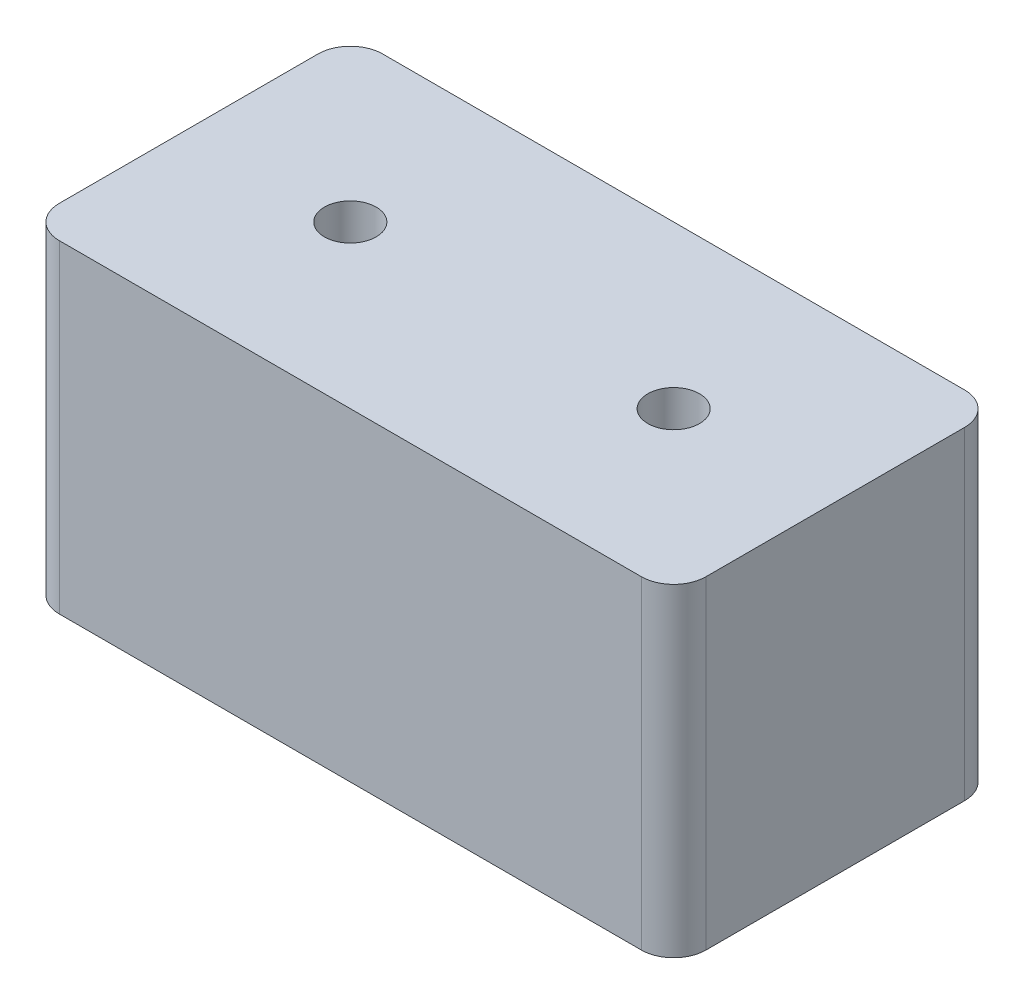
ISO-10303-21;
HEADER;
FILE_DESCRIPTION(('STEP AP214'),'2;1');
FILE_NAME('part.step','',(''),(''),'','','');
FILE_SCHEMA(('AUTOMOTIVE_DESIGN { 1 0 10303 214 1 1 1 1 }'));
ENDSEC;
DATA;
#1=APPLICATION_CONTEXT('core data for automotive mechanical design processes');
#2=APPLICATION_PROTOCOL_DEFINITION('international standard','automotive_design',2000,#1);
#3=PRODUCT_CONTEXT('',#1,'mechanical');
#4=PRODUCT('Part','Part','',(#3));
#5=PRODUCT_RELATED_PRODUCT_CATEGORY('part','',(#4));
#6=PRODUCT_DEFINITION_FORMATION('','',#4);
#7=PRODUCT_DEFINITION_CONTEXT('part definition',#1,'design');
#8=PRODUCT_DEFINITION('design','',#6,#7);
#9=PRODUCT_DEFINITION_SHAPE('','',#8);
#10=(LENGTH_UNIT() NAMED_UNIT(*) SI_UNIT(.MILLI.,.METRE.));
#11=(NAMED_UNIT(*) PLANE_ANGLE_UNIT() SI_UNIT($,.RADIAN.));
#12=(NAMED_UNIT(*) SI_UNIT($,.STERADIAN.) SOLID_ANGLE_UNIT());
#13=UNCERTAINTY_MEASURE_WITH_UNIT(LENGTH_MEASURE(1.E-05),#10,'distance_accuracy_value','');
#14=(GEOMETRIC_REPRESENTATION_CONTEXT(3) GLOBAL_UNCERTAINTY_ASSIGNED_CONTEXT((#13)) GLOBAL_UNIT_ASSIGNED_CONTEXT((#10,
#11,#12)) REPRESENTATION_CONTEXT('',''));
#15=CARTESIAN_POINT('',(0.,0.,0.));
#16=DIRECTION('',(0.,0.,1.));
#17=DIRECTION('',(1.,0.,0.));
#18=AXIS2_PLACEMENT_3D('',#15,#16,#17);
#19=CARTESIAN_POINT('',(0.,20.,0.));
#20=DIRECTION('',(0.,-1.,0.));
#21=DIRECTION('',(0.,0.,-1.));
#22=AXIS2_PLACEMENT_3D('',#19,#20,#21);
#23=PLANE('',#22);
#24=DIRECTION('',(0.,0.,-1.));
#25=VECTOR('',#24,1.);
#26=CARTESIAN_POINT('',(40.,20.,0.));
#27=LINE('',#26,#25);
#28=CARTESIAN_POINT('',(40.,20.,-2.));
#29=VERTEX_POINT('',#28);
#30=CARTESIAN_POINT('',(40.,20.,-18.));
#31=VERTEX_POINT('',#30);
#32=EDGE_CURVE('E204',#29,#31,#27,.T.);
#33=ORIENTED_EDGE('',*,*,#32,.T.);
#34=CARTESIAN_POINT('',(38.,20.,-18.));
#35=DIRECTION('',(0.,-1.,0.));
#36=DIRECTION('',(0.,0.,-1.));
#37=AXIS2_PLACEMENT_3D('',#34,#35,#36);
#38=CIRCLE('',#37,2.);
#39=CARTESIAN_POINT('',(38.,20.,-20.));
#40=VERTEX_POINT('',#39);
#41=EDGE_CURVE('E173',#31,#40,#38,.F.);
#42=ORIENTED_EDGE('',*,*,#41,.T.);
#43=DIRECTION('',(-1.,0.,0.));
#44=VECTOR('',#43,1.);
#45=CARTESIAN_POINT('',(0.,20.,-20.));
#46=LINE('',#45,#44);
#47=CARTESIAN_POINT('',(1.99999999999999,20.,-20.));
#48=VERTEX_POINT('',#47);
#49=EDGE_CURVE('E131',#40,#48,#46,.T.);
#50=ORIENTED_EDGE('',*,*,#49,.T.);
#51=CARTESIAN_POINT('',(1.99999999999999,20.,-18.));
#52=DIRECTION('',(0.,-1.,0.));
#53=DIRECTION('',(0.,0.,-1.));
#54=AXIS2_PLACEMENT_3D('',#51,#52,#53);
#55=CIRCLE('',#54,2.);
#56=CARTESIAN_POINT('',(0.,20.,-18.));
#57=VERTEX_POINT('',#56);
#58=EDGE_CURVE('E165',#48,#57,#55,.F.);
#59=ORIENTED_EDGE('',*,*,#58,.T.);
#60=DIRECTION('',(0.,0.,1.));
#61=VECTOR('',#60,1.);
#62=CARTESIAN_POINT('',(0.,20.,0.));
#63=LINE('',#62,#61);
#64=CARTESIAN_POINT('',(0.,20.,-2.));
#65=VERTEX_POINT('',#64);
#66=EDGE_CURVE('E140',#57,#65,#63,.T.);
#67=ORIENTED_EDGE('',*,*,#66,.T.);
#68=CARTESIAN_POINT('',(2.,20.,-2.));
#69=DIRECTION('',(0.,-1.,0.));
#70=DIRECTION('',(0.,0.,-1.));
#71=AXIS2_PLACEMENT_3D('',#68,#69,#70);
#72=CIRCLE('',#71,2.);
#73=CARTESIAN_POINT('',(2.,20.,0.));
#74=VERTEX_POINT('',#73);
#75=EDGE_CURVE('E66',#65,#74,#72,.F.);
#76=ORIENTED_EDGE('',*,*,#75,.T.);
#77=DIRECTION('',(1.,0.,0.));
#78=VECTOR('',#77,1.);
#79=CARTESIAN_POINT('',(0.,20.,0.));
#80=LINE('',#79,#78);
#81=CARTESIAN_POINT('',(38.,20.,0.));
#82=VERTEX_POINT('',#81);
#83=EDGE_CURVE('E145',#74,#82,#80,.T.);
#84=ORIENTED_EDGE('',*,*,#83,.T.);
#85=CARTESIAN_POINT('',(38.,20.,-2.));
#86=DIRECTION('',(0.,-1.,0.));
#87=DIRECTION('',(0.,0.,-1.));
#88=AXIS2_PLACEMENT_3D('',#85,#86,#87);
#89=CIRCLE('',#88,2.);
#90=EDGE_CURVE('E170',#82,#29,#89,.F.);
#91=ORIENTED_EDGE('',*,*,#90,.T.);
#92=EDGE_LOOP('',(#33,#42,#50,#59,#67,#76,#84,#91));
#93=FACE_BOUND('',#92,.T.);
#94=CARTESIAN_POINT('',(10.,20.,-10.));
#95=DIRECTION('',(0.,1.,0.));
#96=DIRECTION('',(0.,0.,1.));
#97=AXIS2_PLACEMENT_3D('',#94,#95,#96);
#98=CIRCLE('',#97,1.6);
#99=CARTESIAN_POINT('',(10.,20.,-8.4));
#100=VERTEX_POINT('',#99);
#101=EDGE_CURVE('E194',#100,#100,#98,.T.);
#102=ORIENTED_EDGE('',*,*,#101,.F.);
#103=EDGE_LOOP('',(#102));
#104=FACE_BOUND('',#103,.T.);
#105=CARTESIAN_POINT('',(30.,20.,-10.));
#106=DIRECTION('',(0.,1.,0.));
#107=DIRECTION('',(0.,0.,1.));
#108=AXIS2_PLACEMENT_3D('',#105,#106,#107);
#109=CIRCLE('',#108,1.6);
#110=CARTESIAN_POINT('',(30.,20.,-8.4));
#111=VERTEX_POINT('',#110);
#112=EDGE_CURVE('E212',#111,#111,#109,.T.);
#113=ORIENTED_EDGE('',*,*,#112,.F.);
#114=EDGE_LOOP('',(#113));
#115=FACE_BOUND('',#114,.T.);
#116=ADVANCED_FACE('F43',(#93,#104,#115),#23,.F.);
#117=CARTESIAN_POINT('',(0.,0.,0.));
#118=DIRECTION('',(0.,-1.,0.));
#119=DIRECTION('',(0.,0.,-1.));
#120=AXIS2_PLACEMENT_3D('',#117,#118,#119);
#121=PLANE('',#120);
#122=CARTESIAN_POINT('',(10.,0.,-10.));
#123=DIRECTION('',(0.,1.,0.));
#124=DIRECTION('',(0.,0.,1.));
#125=AXIS2_PLACEMENT_3D('',#122,#123,#124);
#126=CIRCLE('',#125,1.6);
#127=CARTESIAN_POINT('',(10.,0.,-8.4));
#128=VERTEX_POINT('',#127);
#129=EDGE_CURVE('E199',#128,#128,#126,.T.);
#130=ORIENTED_EDGE('',*,*,#129,.T.);
#131=EDGE_LOOP('',(#130));
#132=FACE_BOUND('',#131,.T.);
#133=DIRECTION('',(-1.,0.,0.));
#134=VECTOR('',#133,1.);
#135=CARTESIAN_POINT('',(0.,0.,-20.));
#136=LINE('',#135,#134);
#137=CARTESIAN_POINT('',(38.,0.,-20.));
#138=VERTEX_POINT('',#137);
#139=CARTESIAN_POINT('',(1.99999999999999,0.,-20.));
#140=VERTEX_POINT('',#139);
#141=EDGE_CURVE('E128',#138,#140,#136,.T.);
#142=ORIENTED_EDGE('',*,*,#141,.F.);
#143=CARTESIAN_POINT('',(38.,0.,-18.));
#144=DIRECTION('',(0.,-1.,0.));
#145=DIRECTION('',(0.,0.,-1.));
#146=AXIS2_PLACEMENT_3D('',#143,#144,#145);
#147=CIRCLE('',#146,2.);
#148=CARTESIAN_POINT('',(40.,0.,-18.));
#149=VERTEX_POINT('',#148);
#150=EDGE_CURVE('E110',#138,#149,#147,.T.);
#151=ORIENTED_EDGE('',*,*,#150,.T.);
#152=DIRECTION('',(0.,0.,-1.));
#153=VECTOR('',#152,1.);
#154=CARTESIAN_POINT('',(40.,0.,0.));
#155=LINE('',#154,#153);
#156=CARTESIAN_POINT('',(40.,0.,-2.));
#157=VERTEX_POINT('',#156);
#158=EDGE_CURVE('E141',#157,#149,#155,.T.);
#159=ORIENTED_EDGE('',*,*,#158,.F.);
#160=CARTESIAN_POINT('',(38.,0.,-2.));
#161=DIRECTION('',(0.,-1.,0.));
#162=DIRECTION('',(0.,0.,-1.));
#163=AXIS2_PLACEMENT_3D('',#160,#161,#162);
#164=CIRCLE('',#163,2.);
#165=CARTESIAN_POINT('',(38.,0.,0.));
#166=VERTEX_POINT('',#165);
#167=EDGE_CURVE('E122',#157,#166,#164,.T.);
#168=ORIENTED_EDGE('',*,*,#167,.T.);
#169=DIRECTION('',(1.,0.,0.));
#170=VECTOR('',#169,1.);
#171=CARTESIAN_POINT('',(0.,0.,0.));
#172=LINE('',#171,#170);
#173=CARTESIAN_POINT('',(2.,0.,0.));
#174=VERTEX_POINT('',#173);
#175=EDGE_CURVE('E147',#174,#166,#172,.T.);
#176=ORIENTED_EDGE('',*,*,#175,.F.);
#177=CARTESIAN_POINT('',(2.,0.,-2.));
#178=DIRECTION('',(0.,-1.,0.));
#179=DIRECTION('',(0.,0.,-1.));
#180=AXIS2_PLACEMENT_3D('',#177,#178,#179);
#181=CIRCLE('',#180,2.);
#182=CARTESIAN_POINT('',(0.,0.,-2.));
#183=VERTEX_POINT('',#182);
#184=EDGE_CURVE('E155',#174,#183,#181,.T.);
#185=ORIENTED_EDGE('',*,*,#184,.T.);
#186=DIRECTION('',(0.,0.,1.));
#187=VECTOR('',#186,1.);
#188=CARTESIAN_POINT('',(0.,0.,0.));
#189=LINE('',#188,#187);
#190=CARTESIAN_POINT('',(0.,0.,-18.));
#191=VERTEX_POINT('',#190);
#192=EDGE_CURVE('E188',#191,#183,#189,.T.);
#193=ORIENTED_EDGE('',*,*,#192,.F.);
#194=CARTESIAN_POINT('',(1.99999999999999,0.,-18.));
#195=DIRECTION('',(0.,-1.,0.));
#196=DIRECTION('',(0.,0.,-1.));
#197=AXIS2_PLACEMENT_3D('',#194,#195,#196);
#198=CIRCLE('',#197,2.);
#199=EDGE_CURVE('E133',#191,#140,#198,.T.);
#200=ORIENTED_EDGE('',*,*,#199,.T.);
#201=EDGE_LOOP('',(#142,#151,#159,#168,#176,#185,#193,#200));
#202=FACE_BOUND('',#201,.T.);
#203=CARTESIAN_POINT('',(30.,0.,-10.));
#204=DIRECTION('',(0.,1.,0.));
#205=DIRECTION('',(0.,0.,1.));
#206=AXIS2_PLACEMENT_3D('',#203,#204,#205);
#207=CIRCLE('',#206,1.6);
#208=CARTESIAN_POINT('',(30.,0.,-8.4));
#209=VERTEX_POINT('',#208);
#210=EDGE_CURVE('E214',#209,#209,#207,.T.);
#211=ORIENTED_EDGE('',*,*,#210,.T.);
#212=EDGE_LOOP('',(#211));
#213=FACE_BOUND('',#212,.T.);
#214=ADVANCED_FACE('F136',(#132,#202,#213),#121,.T.);
#215=CARTESIAN_POINT('',(0.,20.,0.));
#216=DIRECTION('',(1.,0.,0.));
#217=DIRECTION('',(0.,0.,-1.));
#218=AXIS2_PLACEMENT_3D('',#215,#216,#217);
#219=PLANE('',#218);
#220=ORIENTED_EDGE('',*,*,#192,.T.);
#221=DIRECTION('',(0.,-1.,0.));
#222=VECTOR('',#221,1.);
#223=CARTESIAN_POINT('',(0.,20.,-2.));
#224=LINE('',#223,#222);
#225=EDGE_CURVE('E11',#183,#65,#224,.F.);
#226=ORIENTED_EDGE('',*,*,#225,.T.);
#227=ORIENTED_EDGE('',*,*,#66,.F.);
#228=DIRECTION('',(0.,-1.,0.));
#229=VECTOR('',#228,1.);
#230=CARTESIAN_POINT('',(0.,20.,-18.));
#231=LINE('',#230,#229);
#232=EDGE_CURVE('E52',#57,#191,#231,.T.);
#233=ORIENTED_EDGE('',*,*,#232,.T.);
#234=EDGE_LOOP('',(#220,#226,#227,#233));
#235=FACE_BOUND('',#234,.T.);
#236=ADVANCED_FACE('F187',(#235),#219,.F.);
#237=CARTESIAN_POINT('',(0.,20.,0.));
#238=DIRECTION('',(0.,0.,-1.));
#239=DIRECTION('',(-1.,0.,0.));
#240=AXIS2_PLACEMENT_3D('',#237,#238,#239);
#241=PLANE('',#240);
#242=ORIENTED_EDGE('',*,*,#175,.T.);
#243=DIRECTION('',(0.,-1.,0.));
#244=VECTOR('',#243,1.);
#245=CARTESIAN_POINT('',(38.,20.,0.));
#246=LINE('',#245,#244);
#247=EDGE_CURVE('E59',#166,#82,#246,.F.);
#248=ORIENTED_EDGE('',*,*,#247,.T.);
#249=ORIENTED_EDGE('',*,*,#83,.F.);
#250=DIRECTION('',(0.,-1.,0.));
#251=VECTOR('',#250,1.);
#252=CARTESIAN_POINT('',(2.,20.,0.));
#253=LINE('',#252,#251);
#254=EDGE_CURVE('E176',#74,#174,#253,.T.);
#255=ORIENTED_EDGE('',*,*,#254,.T.);
#256=EDGE_LOOP('',(#242,#248,#249,#255));
#257=FACE_BOUND('',#256,.T.);
#258=ADVANCED_FACE('F242',(#257),#241,.F.);
#259=CARTESIAN_POINT('',(40.,20.,0.));
#260=DIRECTION('',(-1.,0.,0.));
#261=DIRECTION('',(0.,0.,1.));
#262=AXIS2_PLACEMENT_3D('',#259,#260,#261);
#263=PLANE('',#262);
#264=ORIENTED_EDGE('',*,*,#158,.T.);
#265=DIRECTION('',(0.,-1.,0.));
#266=VECTOR('',#265,1.);
#267=CARTESIAN_POINT('',(40.,20.,-18.));
#268=LINE('',#267,#266);
#269=EDGE_CURVE('E115',#149,#31,#268,.F.);
#270=ORIENTED_EDGE('',*,*,#269,.T.);
#271=ORIENTED_EDGE('',*,*,#32,.F.);
#272=DIRECTION('',(0.,-1.,0.));
#273=VECTOR('',#272,1.);
#274=CARTESIAN_POINT('',(40.,20.,-2.));
#275=LINE('',#274,#273);
#276=EDGE_CURVE('E121',#29,#157,#275,.T.);
#277=ORIENTED_EDGE('',*,*,#276,.T.);
#278=EDGE_LOOP('',(#264,#270,#271,#277));
#279=FACE_BOUND('',#278,.T.);
#280=ADVANCED_FACE('F239',(#279),#263,.F.);
#281=CARTESIAN_POINT('',(0.,20.,-20.));
#282=DIRECTION('',(0.,0.,1.));
#283=DIRECTION('',(1.,0.,0.));
#284=AXIS2_PLACEMENT_3D('',#281,#282,#283);
#285=PLANE('',#284);
#286=ORIENTED_EDGE('',*,*,#49,.F.);
#287=DIRECTION('',(0.,-1.,0.));
#288=VECTOR('',#287,1.);
#289=CARTESIAN_POINT('',(38.,20.,-20.));
#290=LINE('',#289,#288);
#291=EDGE_CURVE('E114',#40,#138,#290,.T.);
#292=ORIENTED_EDGE('',*,*,#291,.T.);
#293=ORIENTED_EDGE('',*,*,#141,.T.);
#294=DIRECTION('',(0.,-1.,0.));
#295=VECTOR('',#294,1.);
#296=CARTESIAN_POINT('',(1.99999999999999,20.,-20.));
#297=LINE('',#296,#295);
#298=EDGE_CURVE('E134',#140,#48,#297,.F.);
#299=ORIENTED_EDGE('',*,*,#298,.T.);
#300=EDGE_LOOP('',(#286,#292,#293,#299));
#301=FACE_BOUND('',#300,.T.);
#302=ADVANCED_FACE('F127',(#301),#285,.F.);
#303=CARTESIAN_POINT('',(10.,20.,-10.));
#304=DIRECTION('',(0.,-1.,0.));
#305=DIRECTION('',(0.,0.,-1.));
#306=AXIS2_PLACEMENT_3D('',#303,#304,#305);
#307=CYLINDRICAL_SURFACE('',#306,1.6);
#308=ORIENTED_EDGE('',*,*,#101,.T.);
#309=EDGE_LOOP('',(#308));
#310=FACE_BOUND('',#309,.T.);
#311=ORIENTED_EDGE('',*,*,#129,.F.);
#312=EDGE_LOOP('',(#311));
#313=FACE_BOUND('',#312,.T.);
#314=ADVANCED_FACE('F234',(#310,#313),#307,.F.);
#315=CARTESIAN_POINT('',(30.,20.,-10.));
#316=DIRECTION('',(0.,-1.,0.));
#317=DIRECTION('',(0.,0.,-1.));
#318=AXIS2_PLACEMENT_3D('',#315,#316,#317);
#319=CYLINDRICAL_SURFACE('',#318,1.6);
#320=ORIENTED_EDGE('',*,*,#112,.T.);
#321=EDGE_LOOP('',(#320));
#322=FACE_BOUND('',#321,.T.);
#323=ORIENTED_EDGE('',*,*,#210,.F.);
#324=EDGE_LOOP('',(#323));
#325=FACE_BOUND('',#324,.T.);
#326=ADVANCED_FACE('F222',(#322,#325),#319,.F.);
#327=CARTESIAN_POINT('',(38.,20.,-18.));
#328=DIRECTION('',(0.,-1.,0.));
#329=DIRECTION('',(0.,0.,-1.));
#330=AXIS2_PLACEMENT_3D('',#327,#328,#329);
#331=CYLINDRICAL_SURFACE('',#330,2.);
#332=ORIENTED_EDGE('',*,*,#41,.F.);
#333=ORIENTED_EDGE('',*,*,#269,.F.);
#334=ORIENTED_EDGE('',*,*,#150,.F.);
#335=ORIENTED_EDGE('',*,*,#291,.F.);
#336=EDGE_LOOP('',(#332,#333,#334,#335));
#337=FACE_BOUND('',#336,.T.);
#338=ADVANCED_FACE('F113',(#337),#331,.T.);
#339=CARTESIAN_POINT('',(38.,20.,-2.));
#340=DIRECTION('',(0.,-1.,0.));
#341=DIRECTION('',(0.,0.,-1.));
#342=AXIS2_PLACEMENT_3D('',#339,#340,#341);
#343=CYLINDRICAL_SURFACE('',#342,2.);
#344=ORIENTED_EDGE('',*,*,#90,.F.);
#345=ORIENTED_EDGE('',*,*,#247,.F.);
#346=ORIENTED_EDGE('',*,*,#167,.F.);
#347=ORIENTED_EDGE('',*,*,#276,.F.);
#348=EDGE_LOOP('',(#344,#345,#346,#347));
#349=FACE_BOUND('',#348,.T.);
#350=ADVANCED_FACE('F250',(#349),#343,.T.);
#351=CARTESIAN_POINT('',(2.,20.,-2.));
#352=DIRECTION('',(0.,-1.,0.));
#353=DIRECTION('',(0.,0.,-1.));
#354=AXIS2_PLACEMENT_3D('',#351,#352,#353);
#355=CYLINDRICAL_SURFACE('',#354,2.);
#356=ORIENTED_EDGE('',*,*,#75,.F.);
#357=ORIENTED_EDGE('',*,*,#225,.F.);
#358=ORIENTED_EDGE('',*,*,#184,.F.);
#359=ORIENTED_EDGE('',*,*,#254,.F.);
#360=EDGE_LOOP('',(#356,#357,#358,#359));
#361=FACE_BOUND('',#360,.T.);
#362=ADVANCED_FACE('F252',(#361),#355,.T.);
#363=CARTESIAN_POINT('',(1.99999999999999,20.,-18.));
#364=DIRECTION('',(0.,-1.,0.));
#365=DIRECTION('',(0.,0.,-1.));
#366=AXIS2_PLACEMENT_3D('',#363,#364,#365);
#367=CYLINDRICAL_SURFACE('',#366,2.);
#368=ORIENTED_EDGE('',*,*,#58,.F.);
#369=ORIENTED_EDGE('',*,*,#298,.F.);
#370=ORIENTED_EDGE('',*,*,#199,.F.);
#371=ORIENTED_EDGE('',*,*,#232,.F.);
#372=EDGE_LOOP('',(#368,#369,#370,#371));
#373=FACE_BOUND('',#372,.T.);
#374=ADVANCED_FACE('F45',(#373),#367,.T.);
#375=CLOSED_SHELL('',(#116,#214,#236,#258,#280,#302,#314,#326,#338,#350,#362,#374));
#376=MANIFOLD_SOLID_BREP('B2',#375);
#377=ADVANCED_BREP_SHAPE_REPRESENTATION('',(#18,#376),#14);
#378=SHAPE_DEFINITION_REPRESENTATION(#9,#377);
ENDSEC;
END-ISO-10303-21;
